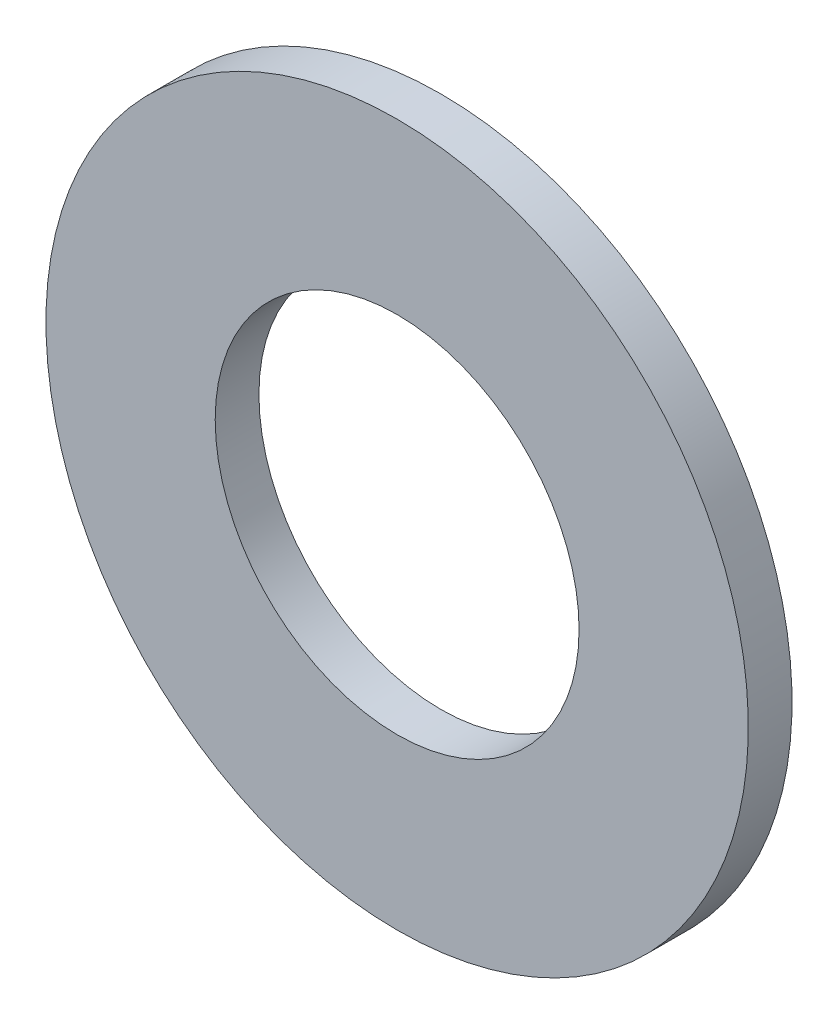
ISO-10303-21;
HEADER;
FILE_DESCRIPTION(('STEP AP214'),'2;1');
FILE_NAME('part.step','',(''),(''),'','','');
FILE_SCHEMA(('AUTOMOTIVE_DESIGN { 1 0 10303 214 1 1 1 1 }'));
ENDSEC;
DATA;
#1=APPLICATION_CONTEXT('core data for automotive mechanical design processes');
#2=APPLICATION_PROTOCOL_DEFINITION('international standard','automotive_design',2000,#1);
#3=PRODUCT_CONTEXT('',#1,'mechanical');
#4=PRODUCT('Part','Part','',(#3));
#5=PRODUCT_RELATED_PRODUCT_CATEGORY('part','',(#4));
#6=PRODUCT_DEFINITION_FORMATION('','',#4);
#7=PRODUCT_DEFINITION_CONTEXT('part definition',#1,'design');
#8=PRODUCT_DEFINITION('design','',#6,#7);
#9=PRODUCT_DEFINITION_SHAPE('','',#8);
#10=(LENGTH_UNIT() NAMED_UNIT(*) SI_UNIT(.MILLI.,.METRE.));
#11=(NAMED_UNIT(*) PLANE_ANGLE_UNIT() SI_UNIT($,.RADIAN.));
#12=(NAMED_UNIT(*) SI_UNIT($,.STERADIAN.) SOLID_ANGLE_UNIT());
#13=UNCERTAINTY_MEASURE_WITH_UNIT(LENGTH_MEASURE(1.E-05),#10,'distance_accuracy_value','');
#14=(GEOMETRIC_REPRESENTATION_CONTEXT(3) GLOBAL_UNCERTAINTY_ASSIGNED_CONTEXT((#13)) GLOBAL_UNIT_ASSIGNED_CONTEXT((#10,
#11,#12)) REPRESENTATION_CONTEXT('',''));
#15=CARTESIAN_POINT('',(0.,0.,0.));
#16=DIRECTION('',(0.,0.,1.));
#17=DIRECTION('',(1.,0.,0.));
#18=AXIS2_PLACEMENT_3D('',#15,#16,#17);
#19=CARTESIAN_POINT('',(-2.4980018054066E-13,0.,0.));
#20=DIRECTION('',(0.,0.,1.));
#21=DIRECTION('',(0.,-1.,0.));
#22=AXIS2_PLACEMENT_3D('',#19,#20,#21);
#23=PLANE('',#22);
#24=CARTESIAN_POINT('',(0.,0.,0.));
#25=DIRECTION('',(0.,0.,-1.));
#26=DIRECTION('',(0.,1.,0.));
#27=AXIS2_PLACEMENT_3D('',#24,#25,#26);
#28=CIRCLE('',#27,3.2766);
#29=CARTESIAN_POINT('',(0.,3.2766,0.));
#30=VERTEX_POINT('',#29);
#31=EDGE_CURVE('E26',#30,#30,#28,.F.);
#32=ORIENTED_EDGE('',*,*,#31,.T.);
#33=EDGE_LOOP('',(#32));
#34=FACE_BOUND('',#33,.T.);
#35=CARTESIAN_POINT('',(0.,0.,0.));
#36=DIRECTION('',(0.,0.,-1.));
#37=DIRECTION('',(0.,1.,0.));
#38=AXIS2_PLACEMENT_3D('',#35,#36,#37);
#39=CIRCLE('',#38,6.3246);
#40=CARTESIAN_POINT('',(0.,6.3246,0.));
#41=VERTEX_POINT('',#40);
#42=EDGE_CURVE('E17',#41,#41,#39,.F.);
#43=ORIENTED_EDGE('',*,*,#42,.F.);
#44=EDGE_LOOP('',(#43));
#45=FACE_BOUND('',#44,.T.);
#46=ADVANCED_FACE('F14',(#34,#45),#23,.F.);
#47=CARTESIAN_POINT('',(0.,0.,0.787400000000001));
#48=DIRECTION('',(0.,0.,-1.));
#49=DIRECTION('',(0.,1.,0.));
#50=AXIS2_PLACEMENT_3D('',#47,#48,#49);
#51=CYLINDRICAL_SURFACE('',#50,6.3246);
#52=ORIENTED_EDGE('',*,*,#42,.T.);
#53=EDGE_LOOP('',(#52));
#54=FACE_BOUND('',#53,.T.);
#55=CARTESIAN_POINT('',(0.,0.,0.787400000000001));
#56=DIRECTION('',(0.,0.,-1.));
#57=DIRECTION('',(0.,1.,0.));
#58=AXIS2_PLACEMENT_3D('',#55,#56,#57);
#59=CIRCLE('',#58,6.3246);
#60=CARTESIAN_POINT('',(0.,6.3246,0.787400000000001));
#61=VERTEX_POINT('',#60);
#62=EDGE_CURVE('E21',#61,#61,#59,.F.);
#63=ORIENTED_EDGE('',*,*,#62,.F.);
#64=EDGE_LOOP('',(#63));
#65=FACE_BOUND('',#64,.T.);
#66=ADVANCED_FACE('F34',(#54,#65),#51,.T.);
#67=CARTESIAN_POINT('',(0.,0.,0.787400000000001));
#68=DIRECTION('',(0.,0.,-1.));
#69=DIRECTION('',(0.,1.,0.));
#70=AXIS2_PLACEMENT_3D('',#67,#68,#69);
#71=CYLINDRICAL_SURFACE('',#70,3.2766);
#72=CARTESIAN_POINT('',(0.,0.,0.787400000000001));
#73=DIRECTION('',(0.,0.,-1.));
#74=DIRECTION('',(0.,1.,0.));
#75=AXIS2_PLACEMENT_3D('',#72,#73,#74);
#76=CIRCLE('',#75,3.2766);
#77=CARTESIAN_POINT('',(0.,3.2766,0.787400000000001));
#78=VERTEX_POINT('',#77);
#79=EDGE_CURVE('E10',#78,#78,#76,.T.);
#80=ORIENTED_EDGE('',*,*,#79,.F.);
#81=EDGE_LOOP('',(#80));
#82=FACE_BOUND('',#81,.T.);
#83=ORIENTED_EDGE('',*,*,#31,.F.);
#84=EDGE_LOOP('',(#83));
#85=FACE_BOUND('',#84,.T.);
#86=ADVANCED_FACE('F42',(#82,#85),#71,.F.);
#87=CARTESIAN_POINT('',(0.,0.,0.787400000000001));
#88=DIRECTION('',(0.,0.,1.));
#89=DIRECTION('',(0.,-1.,0.));
#90=AXIS2_PLACEMENT_3D('',#87,#88,#89);
#91=PLANE('',#90);
#92=ORIENTED_EDGE('',*,*,#79,.T.);
#93=EDGE_LOOP('',(#92));
#94=FACE_BOUND('',#93,.T.);
#95=ORIENTED_EDGE('',*,*,#62,.T.);
#96=EDGE_LOOP('',(#95));
#97=FACE_BOUND('',#96,.T.);
#98=ADVANCED_FACE('F43',(#94,#97),#91,.T.);
#99=CLOSED_SHELL('',(#46,#66,#86,#98));
#100=MANIFOLD_SOLID_BREP('B1',#99);
#101=ADVANCED_BREP_SHAPE_REPRESENTATION('',(#18,#100),#14);
#102=SHAPE_DEFINITION_REPRESENTATION(#9,#101);
ENDSEC;
END-ISO-10303-21;
